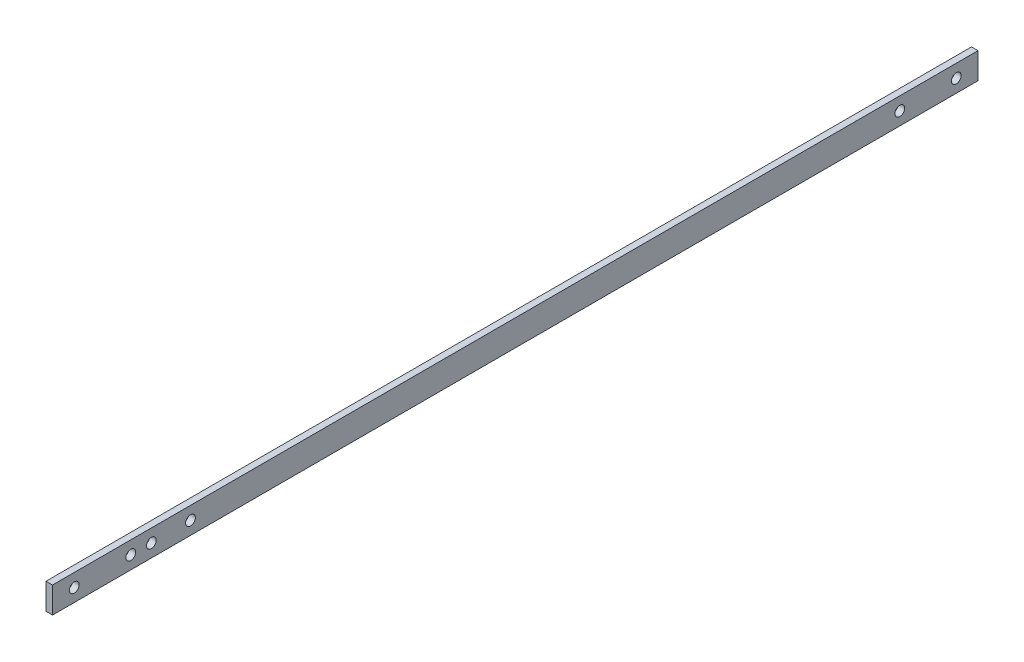
ISO-10303-21;
HEADER;
FILE_DESCRIPTION(('STEP AP214'),'2;1');
FILE_NAME('part.step','',(''),(''),'','','');
FILE_SCHEMA(('AUTOMOTIVE_DESIGN { 1 0 10303 214 1 1 1 1 }'));
ENDSEC;
DATA;
#1=APPLICATION_CONTEXT('core data for automotive mechanical design processes');
#2=APPLICATION_PROTOCOL_DEFINITION('international standard','automotive_design',2000,#1);
#3=PRODUCT_CONTEXT('',#1,'mechanical');
#4=PRODUCT('Part','Part','',(#3));
#5=PRODUCT_RELATED_PRODUCT_CATEGORY('part','',(#4));
#6=PRODUCT_DEFINITION_FORMATION('','',#4);
#7=PRODUCT_DEFINITION_CONTEXT('part definition',#1,'design');
#8=PRODUCT_DEFINITION('design','',#6,#7);
#9=PRODUCT_DEFINITION_SHAPE('','',#8);
#10=(LENGTH_UNIT() NAMED_UNIT(*) SI_UNIT(.MILLI.,.METRE.));
#11=(NAMED_UNIT(*) PLANE_ANGLE_UNIT() SI_UNIT($,.RADIAN.));
#12=(NAMED_UNIT(*) SI_UNIT($,.STERADIAN.) SOLID_ANGLE_UNIT());
#13=UNCERTAINTY_MEASURE_WITH_UNIT(LENGTH_MEASURE(1.E-05),#10,'distance_accuracy_value','');
#14=(GEOMETRIC_REPRESENTATION_CONTEXT(3) GLOBAL_UNCERTAINTY_ASSIGNED_CONTEXT((#13)) GLOBAL_UNIT_ASSIGNED_CONTEXT((#10,
#11,#12)) REPRESENTATION_CONTEXT('',''));
#15=CARTESIAN_POINT('',(0.,0.,0.));
#16=DIRECTION('',(0.,0.,1.));
#17=DIRECTION('',(1.,0.,0.));
#18=AXIS2_PLACEMENT_3D('',#15,#16,#17);
#19=CARTESIAN_POINT('',(3.,0.,0.));
#20=DIRECTION('',(-1.,0.,0.));
#21=DIRECTION('',(0.,0.,1.));
#22=AXIS2_PLACEMENT_3D('',#19,#20,#21);
#23=PLANE('',#22);
#24=DIRECTION('',(0.,-1.,0.));
#25=VECTOR('',#24,1.);
#26=CARTESIAN_POINT('',(3.,0.,0.));
#27=LINE('',#26,#25);
#28=CARTESIAN_POINT('',(3.,12.,0.));
#29=VERTEX_POINT('',#28);
#30=CARTESIAN_POINT('',(3.,0.,0.));
#31=VERTEX_POINT('',#30);
#32=EDGE_CURVE('E92',#29,#31,#27,.T.);
#33=ORIENTED_EDGE('',*,*,#32,.T.);
#34=DIRECTION('',(0.,0.,-1.));
#35=VECTOR('',#34,1.);
#36=CARTESIAN_POINT('',(3.,0.,0.));
#37=LINE('',#36,#35);
#38=CARTESIAN_POINT('',(3.,0.,-426.));
#39=VERTEX_POINT('',#38);
#40=EDGE_CURVE('E87',#31,#39,#37,.T.);
#41=ORIENTED_EDGE('',*,*,#40,.T.);
#42=DIRECTION('',(0.,1.,0.));
#43=VECTOR('',#42,1.);
#44=CARTESIAN_POINT('',(3.,0.,-426.));
#45=LINE('',#44,#43);
#46=CARTESIAN_POINT('',(3.,12.,-426.));
#47=VERTEX_POINT('',#46);
#48=EDGE_CURVE('E90',#39,#47,#45,.T.);
#49=ORIENTED_EDGE('',*,*,#48,.T.);
#50=DIRECTION('',(0.,0.,1.));
#51=VECTOR('',#50,1.);
#52=CARTESIAN_POINT('',(3.,12.,0.));
#53=LINE('',#52,#51);
#54=EDGE_CURVE('E57',#47,#29,#53,.T.);
#55=ORIENTED_EDGE('',*,*,#54,.T.);
#56=EDGE_LOOP('',(#33,#41,#49,#55));
#57=FACE_BOUND('',#56,.T.);
#58=CARTESIAN_POINT('',(3.,6.,-10.));
#59=DIRECTION('',(1.,0.,0.));
#60=DIRECTION('',(0.,0.,-1.));
#61=AXIS2_PLACEMENT_3D('',#58,#59,#60);
#62=CIRCLE('',#61,2.25);
#63=CARTESIAN_POINT('',(3.,6.,-12.25));
#64=VERTEX_POINT('',#63);
#65=EDGE_CURVE('E107',#64,#64,#62,.T.);
#66=ORIENTED_EDGE('',*,*,#65,.F.);
#67=EDGE_LOOP('',(#66));
#68=FACE_BOUND('',#67,.T.);
#69=CARTESIAN_POINT('',(3.,6.,-416.));
#70=DIRECTION('',(1.,0.,0.));
#71=DIRECTION('',(0.,0.,-1.));
#72=AXIS2_PLACEMENT_3D('',#69,#70,#71);
#73=CIRCLE('',#72,2.24999999999995);
#74=CARTESIAN_POINT('',(3.,6.,-418.25));
#75=VERTEX_POINT('',#74);
#76=EDGE_CURVE('E122',#75,#75,#73,.T.);
#77=ORIENTED_EDGE('',*,*,#76,.F.);
#78=EDGE_LOOP('',(#77));
#79=FACE_BOUND('',#78,.T.);
#80=CARTESIAN_POINT('',(3.,5.99999999999999,-36.));
#81=DIRECTION('',(1.,0.,0.));
#82=DIRECTION('',(0.,0.,-1.));
#83=AXIS2_PLACEMENT_3D('',#80,#81,#82);
#84=CIRCLE('',#83,2.25);
#85=CARTESIAN_POINT('',(3.,5.99999999999999,-38.25));
#86=VERTEX_POINT('',#85);
#87=EDGE_CURVE('E128',#86,#86,#84,.T.);
#88=ORIENTED_EDGE('',*,*,#87,.F.);
#89=EDGE_LOOP('',(#88));
#90=FACE_BOUND('',#89,.T.);
#91=CARTESIAN_POINT('',(3.,6.,-390.));
#92=DIRECTION('',(1.,0.,0.));
#93=DIRECTION('',(0.,0.,-1.));
#94=AXIS2_PLACEMENT_3D('',#91,#92,#93);
#95=CIRCLE('',#94,2.24999999999995);
#96=CARTESIAN_POINT('',(3.,6.,-392.25));
#97=VERTEX_POINT('',#96);
#98=EDGE_CURVE('E134',#97,#97,#95,.T.);
#99=ORIENTED_EDGE('',*,*,#98,.F.);
#100=EDGE_LOOP('',(#99));
#101=FACE_BOUND('',#100,.T.);
#102=CARTESIAN_POINT('',(3.,5.99999999999999,-45.5));
#103=DIRECTION('',(1.,0.,0.));
#104=DIRECTION('',(0.,0.,-1.));
#105=AXIS2_PLACEMENT_3D('',#102,#103,#104);
#106=CIRCLE('',#105,2.25);
#107=CARTESIAN_POINT('',(3.,5.99999999999999,-47.75));
#108=VERTEX_POINT('',#107);
#109=EDGE_CURVE('E140',#108,#108,#106,.T.);
#110=ORIENTED_EDGE('',*,*,#109,.F.);
#111=EDGE_LOOP('',(#110));
#112=FACE_BOUND('',#111,.T.);
#113=CARTESIAN_POINT('',(3.,5.99999999999998,-63.5));
#114=DIRECTION('',(1.,0.,0.));
#115=DIRECTION('',(0.,0.,-1.));
#116=AXIS2_PLACEMENT_3D('',#113,#114,#115);
#117=CIRCLE('',#116,2.25);
#118=CARTESIAN_POINT('',(3.,5.99999999999998,-65.75));
#119=VERTEX_POINT('',#118);
#120=EDGE_CURVE('E146',#119,#119,#117,.T.);
#121=ORIENTED_EDGE('',*,*,#120,.F.);
#122=EDGE_LOOP('',(#121));
#123=FACE_BOUND('',#122,.T.);
#124=ADVANCED_FACE('F40',(#57,#68,#79,#90,#101,#112,#123),#23,.F.);
#125=CARTESIAN_POINT('',(0.,0.,0.));
#126=DIRECTION('',(-1.,0.,0.));
#127=DIRECTION('',(0.,0.,1.));
#128=AXIS2_PLACEMENT_3D('',#125,#126,#127);
#129=PLANE('',#128);
#130=CARTESIAN_POINT('',(0.,5.99999999999999,-45.5));
#131=DIRECTION('',(1.,0.,0.));
#132=DIRECTION('',(0.,0.,-1.));
#133=AXIS2_PLACEMENT_3D('',#130,#131,#132);
#134=CIRCLE('',#133,2.25);
#135=CARTESIAN_POINT('',(0.,5.99999999999999,-47.75));
#136=VERTEX_POINT('',#135);
#137=EDGE_CURVE('E143',#136,#136,#134,.T.);
#138=ORIENTED_EDGE('',*,*,#137,.T.);
#139=EDGE_LOOP('',(#138));
#140=FACE_BOUND('',#139,.T.);
#141=CARTESIAN_POINT('',(0.,5.99999999999999,-36.));
#142=DIRECTION('',(1.,0.,0.));
#143=DIRECTION('',(0.,0.,-1.));
#144=AXIS2_PLACEMENT_3D('',#141,#142,#143);
#145=CIRCLE('',#144,2.25);
#146=CARTESIAN_POINT('',(0.,5.99999999999999,-38.25));
#147=VERTEX_POINT('',#146);
#148=EDGE_CURVE('E131',#147,#147,#145,.T.);
#149=ORIENTED_EDGE('',*,*,#148,.T.);
#150=EDGE_LOOP('',(#149));
#151=FACE_BOUND('',#150,.T.);
#152=CARTESIAN_POINT('',(0.,6.,-10.));
#153=DIRECTION('',(1.,0.,0.));
#154=DIRECTION('',(0.,0.,-1.));
#155=AXIS2_PLACEMENT_3D('',#152,#153,#154);
#156=CIRCLE('',#155,2.25);
#157=CARTESIAN_POINT('',(0.,6.,-12.25));
#158=VERTEX_POINT('',#157);
#159=EDGE_CURVE('E119',#158,#158,#156,.T.);
#160=ORIENTED_EDGE('',*,*,#159,.T.);
#161=EDGE_LOOP('',(#160));
#162=FACE_BOUND('',#161,.T.);
#163=DIRECTION('',(0.,-1.,0.));
#164=VECTOR('',#163,1.);
#165=CARTESIAN_POINT('',(0.,0.,0.));
#166=LINE('',#165,#164);
#167=CARTESIAN_POINT('',(0.,12.,0.));
#168=VERTEX_POINT('',#167);
#169=CARTESIAN_POINT('',(0.,0.,0.));
#170=VERTEX_POINT('',#169);
#171=EDGE_CURVE('E104',#168,#170,#166,.T.);
#172=ORIENTED_EDGE('',*,*,#171,.F.);
#173=DIRECTION('',(0.,0.,1.));
#174=VECTOR('',#173,1.);
#175=CARTESIAN_POINT('',(0.,12.,0.));
#176=LINE('',#175,#174);
#177=CARTESIAN_POINT('',(0.,12.,-426.));
#178=VERTEX_POINT('',#177);
#179=EDGE_CURVE('E80',#178,#168,#176,.T.);
#180=ORIENTED_EDGE('',*,*,#179,.F.);
#181=DIRECTION('',(0.,1.,0.));
#182=VECTOR('',#181,1.);
#183=CARTESIAN_POINT('',(0.,0.,-426.));
#184=LINE('',#183,#182);
#185=CARTESIAN_POINT('',(0.,0.,-426.));
#186=VERTEX_POINT('',#185);
#187=EDGE_CURVE('E74',#186,#178,#184,.T.);
#188=ORIENTED_EDGE('',*,*,#187,.F.);
#189=DIRECTION('',(0.,0.,-1.));
#190=VECTOR('',#189,1.);
#191=CARTESIAN_POINT('',(0.,0.,0.));
#192=LINE('',#191,#190);
#193=EDGE_CURVE('E96',#170,#186,#192,.T.);
#194=ORIENTED_EDGE('',*,*,#193,.F.);
#195=EDGE_LOOP('',(#172,#180,#188,#194));
#196=FACE_BOUND('',#195,.T.);
#197=CARTESIAN_POINT('',(0.,6.,-416.));
#198=DIRECTION('',(1.,0.,0.));
#199=DIRECTION('',(0.,0.,-1.));
#200=AXIS2_PLACEMENT_3D('',#197,#198,#199);
#201=CIRCLE('',#200,2.24999999999995);
#202=CARTESIAN_POINT('',(0.,6.,-418.25));
#203=VERTEX_POINT('',#202);
#204=EDGE_CURVE('E125',#203,#203,#201,.T.);
#205=ORIENTED_EDGE('',*,*,#204,.T.);
#206=EDGE_LOOP('',(#205));
#207=FACE_BOUND('',#206,.T.);
#208=CARTESIAN_POINT('',(0.,6.,-390.));
#209=DIRECTION('',(1.,0.,0.));
#210=DIRECTION('',(0.,0.,-1.));
#211=AXIS2_PLACEMENT_3D('',#208,#209,#210);
#212=CIRCLE('',#211,2.24999999999995);
#213=CARTESIAN_POINT('',(0.,6.,-392.25));
#214=VERTEX_POINT('',#213);
#215=EDGE_CURVE('E137',#214,#214,#212,.T.);
#216=ORIENTED_EDGE('',*,*,#215,.T.);
#217=EDGE_LOOP('',(#216));
#218=FACE_BOUND('',#217,.T.);
#219=CARTESIAN_POINT('',(0.,5.99999999999998,-63.5));
#220=DIRECTION('',(1.,0.,0.));
#221=DIRECTION('',(0.,0.,-1.));
#222=AXIS2_PLACEMENT_3D('',#219,#220,#221);
#223=CIRCLE('',#222,2.25);
#224=CARTESIAN_POINT('',(0.,5.99999999999998,-65.75));
#225=VERTEX_POINT('',#224);
#226=EDGE_CURVE('E149',#225,#225,#223,.T.);
#227=ORIENTED_EDGE('',*,*,#226,.T.);
#228=EDGE_LOOP('',(#227));
#229=FACE_BOUND('',#228,.T.);
#230=ADVANCED_FACE('F115',(#140,#151,#162,#196,#207,#218,#229),#129,.T.);
#231=CARTESIAN_POINT('',(3.,0.,0.));
#232=DIRECTION('',(0.,0.,-1.));
#233=DIRECTION('',(-1.,0.,0.));
#234=AXIS2_PLACEMENT_3D('',#231,#232,#233);
#235=PLANE('',#234);
#236=ORIENTED_EDGE('',*,*,#171,.T.);
#237=DIRECTION('',(-1.,0.,0.));
#238=VECTOR('',#237,1.);
#239=CARTESIAN_POINT('',(3.,0.,0.));
#240=LINE('',#239,#238);
#241=EDGE_CURVE('E11',#31,#170,#240,.T.);
#242=ORIENTED_EDGE('',*,*,#241,.F.);
#243=ORIENTED_EDGE('',*,*,#32,.F.);
#244=DIRECTION('',(-1.,0.,0.));
#245=VECTOR('',#244,1.);
#246=CARTESIAN_POINT('',(3.,12.,0.));
#247=LINE('',#246,#245);
#248=EDGE_CURVE('E100',#29,#168,#247,.T.);
#249=ORIENTED_EDGE('',*,*,#248,.T.);
#250=EDGE_LOOP('',(#236,#242,#243,#249));
#251=FACE_BOUND('',#250,.T.);
#252=ADVANCED_FACE('F42',(#251),#235,.F.);
#253=CARTESIAN_POINT('',(3.,0.,0.));
#254=DIRECTION('',(0.,1.,0.));
#255=DIRECTION('',(0.,0.,1.));
#256=AXIS2_PLACEMENT_3D('',#253,#254,#255);
#257=PLANE('',#256);
#258=ORIENTED_EDGE('',*,*,#193,.T.);
#259=DIRECTION('',(-1.,0.,0.));
#260=VECTOR('',#259,1.);
#261=CARTESIAN_POINT('',(3.,0.,-426.));
#262=LINE('',#261,#260);
#263=EDGE_CURVE('E49',#39,#186,#262,.T.);
#264=ORIENTED_EDGE('',*,*,#263,.F.);
#265=ORIENTED_EDGE('',*,*,#40,.F.);
#266=ORIENTED_EDGE('',*,*,#241,.T.);
#267=EDGE_LOOP('',(#258,#264,#265,#266));
#268=FACE_BOUND('',#267,.T.);
#269=ADVANCED_FACE('F95',(#268),#257,.F.);
#270=CARTESIAN_POINT('',(3.,0.,-426.));
#271=DIRECTION('',(0.,0.,1.));
#272=DIRECTION('',(1.,0.,0.));
#273=AXIS2_PLACEMENT_3D('',#270,#271,#272);
#274=PLANE('',#273);
#275=ORIENTED_EDGE('',*,*,#187,.T.);
#276=DIRECTION('',(-1.,0.,0.));
#277=VECTOR('',#276,1.);
#278=CARTESIAN_POINT('',(3.,12.,-426.));
#279=LINE('',#278,#277);
#280=EDGE_CURVE('E97',#47,#178,#279,.T.);
#281=ORIENTED_EDGE('',*,*,#280,.F.);
#282=ORIENTED_EDGE('',*,*,#48,.F.);
#283=ORIENTED_EDGE('',*,*,#263,.T.);
#284=EDGE_LOOP('',(#275,#281,#282,#283));
#285=FACE_BOUND('',#284,.T.);
#286=ADVANCED_FACE('F98',(#285),#274,.F.);
#287=CARTESIAN_POINT('',(3.,12.,0.));
#288=DIRECTION('',(0.,-1.,0.));
#289=DIRECTION('',(0.,0.,-1.));
#290=AXIS2_PLACEMENT_3D('',#287,#288,#289);
#291=PLANE('',#290);
#292=ORIENTED_EDGE('',*,*,#179,.T.);
#293=ORIENTED_EDGE('',*,*,#248,.F.);
#294=ORIENTED_EDGE('',*,*,#54,.F.);
#295=ORIENTED_EDGE('',*,*,#280,.T.);
#296=EDGE_LOOP('',(#292,#293,#294,#295));
#297=FACE_BOUND('',#296,.T.);
#298=ADVANCED_FACE('F112',(#297),#291,.F.);
#299=CARTESIAN_POINT('',(3.,6.,-10.));
#300=DIRECTION('',(-1.,0.,0.));
#301=DIRECTION('',(0.,0.,1.));
#302=AXIS2_PLACEMENT_3D('',#299,#300,#301);
#303=CYLINDRICAL_SURFACE('',#302,2.25);
#304=ORIENTED_EDGE('',*,*,#65,.T.);
#305=EDGE_LOOP('',(#304));
#306=FACE_BOUND('',#305,.T.);
#307=ORIENTED_EDGE('',*,*,#159,.F.);
#308=EDGE_LOOP('',(#307));
#309=FACE_BOUND('',#308,.T.);
#310=ADVANCED_FACE('F166',(#306,#309),#303,.F.);
#311=CARTESIAN_POINT('',(3.,6.,-416.));
#312=DIRECTION('',(-1.,0.,0.));
#313=DIRECTION('',(0.,0.,1.));
#314=AXIS2_PLACEMENT_3D('',#311,#312,#313);
#315=CYLINDRICAL_SURFACE('',#314,2.24999999999995);
#316=ORIENTED_EDGE('',*,*,#76,.T.);
#317=EDGE_LOOP('',(#316));
#318=FACE_BOUND('',#317,.T.);
#319=ORIENTED_EDGE('',*,*,#204,.F.);
#320=EDGE_LOOP('',(#319));
#321=FACE_BOUND('',#320,.T.);
#322=ADVANCED_FACE('F220',(#318,#321),#315,.F.);
#323=CARTESIAN_POINT('',(3.,5.99999999999999,-36.));
#324=DIRECTION('',(-1.,0.,0.));
#325=DIRECTION('',(0.,0.,1.));
#326=AXIS2_PLACEMENT_3D('',#323,#324,#325);
#327=CYLINDRICAL_SURFACE('',#326,2.25);
#328=ORIENTED_EDGE('',*,*,#87,.T.);
#329=EDGE_LOOP('',(#328));
#330=FACE_BOUND('',#329,.T.);
#331=ORIENTED_EDGE('',*,*,#148,.F.);
#332=EDGE_LOOP('',(#331));
#333=FACE_BOUND('',#332,.T.);
#334=ADVANCED_FACE('F229',(#330,#333),#327,.F.);
#335=CARTESIAN_POINT('',(3.,6.,-390.));
#336=DIRECTION('',(-1.,0.,0.));
#337=DIRECTION('',(0.,0.,1.));
#338=AXIS2_PLACEMENT_3D('',#335,#336,#337);
#339=CYLINDRICAL_SURFACE('',#338,2.24999999999995);
#340=ORIENTED_EDGE('',*,*,#98,.T.);
#341=EDGE_LOOP('',(#340));
#342=FACE_BOUND('',#341,.T.);
#343=ORIENTED_EDGE('',*,*,#215,.F.);
#344=EDGE_LOOP('',(#343));
#345=FACE_BOUND('',#344,.T.);
#346=ADVANCED_FACE('F238',(#342,#345),#339,.F.);
#347=CARTESIAN_POINT('',(3.,5.99999999999999,-45.5));
#348=DIRECTION('',(-1.,0.,0.));
#349=DIRECTION('',(0.,0.,1.));
#350=AXIS2_PLACEMENT_3D('',#347,#348,#349);
#351=CYLINDRICAL_SURFACE('',#350,2.25);
#352=ORIENTED_EDGE('',*,*,#109,.T.);
#353=EDGE_LOOP('',(#352));
#354=FACE_BOUND('',#353,.T.);
#355=ORIENTED_EDGE('',*,*,#137,.F.);
#356=EDGE_LOOP('',(#355));
#357=FACE_BOUND('',#356,.T.);
#358=ADVANCED_FACE('F248',(#354,#357),#351,.F.);
#359=CARTESIAN_POINT('',(3.,5.99999999999998,-63.5));
#360=DIRECTION('',(-1.,0.,0.));
#361=DIRECTION('',(0.,0.,1.));
#362=AXIS2_PLACEMENT_3D('',#359,#360,#361);
#363=CYLINDRICAL_SURFACE('',#362,2.25);
#364=ORIENTED_EDGE('',*,*,#120,.T.);
#365=EDGE_LOOP('',(#364));
#366=FACE_BOUND('',#365,.T.);
#367=ORIENTED_EDGE('',*,*,#226,.F.);
#368=EDGE_LOOP('',(#367));
#369=FACE_BOUND('',#368,.T.);
#370=ADVANCED_FACE('F155',(#366,#369),#363,.F.);
#371=CLOSED_SHELL('',(#124,#230,#252,#269,#286,#298,#310,#322,#334,#346,#358,#370));
#372=MANIFOLD_SOLID_BREP('B2',#371);
#373=ADVANCED_BREP_SHAPE_REPRESENTATION('',(#18,#372),#14);
#374=SHAPE_DEFINITION_REPRESENTATION(#9,#373);
ENDSEC;
END-ISO-10303-21;
